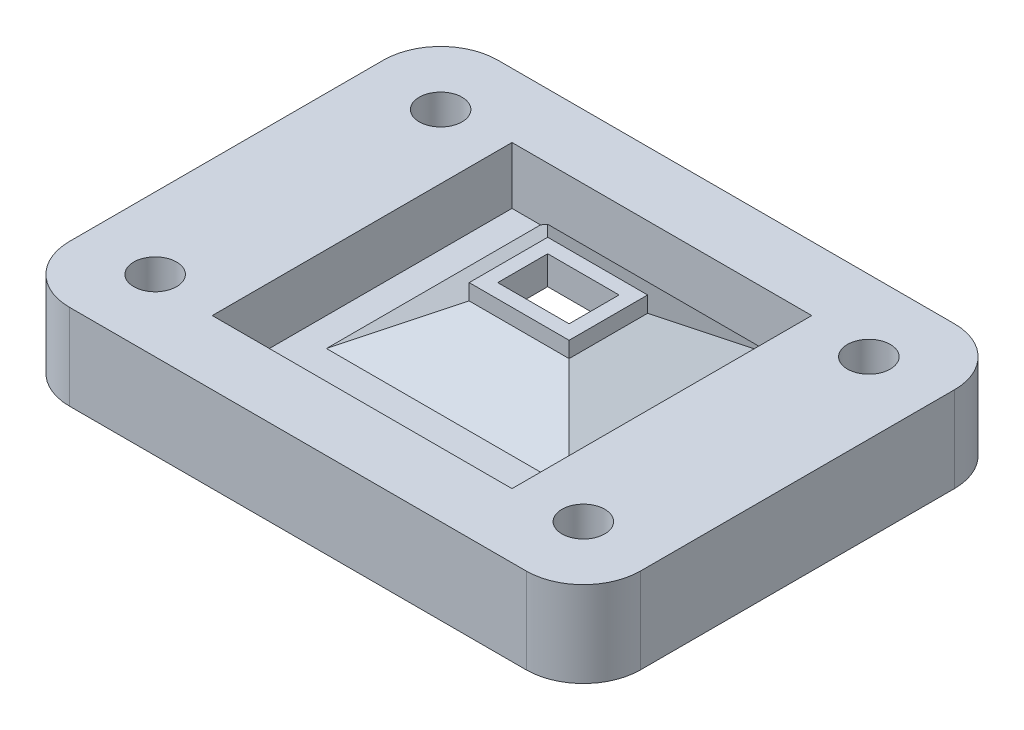
ISO-10303-21;
HEADER;
FILE_DESCRIPTION(('STEP AP214'),'2;1');
FILE_NAME('part.step','',(''),(''),'','','');
FILE_SCHEMA(('AUTOMOTIVE_DESIGN { 1 0 10303 214 1 1 1 1 }'));
ENDSEC;
DATA;
#1=APPLICATION_CONTEXT('core data for automotive mechanical design processes');
#2=APPLICATION_PROTOCOL_DEFINITION('international standard','automotive_design',2000,#1);
#3=PRODUCT_CONTEXT('',#1,'mechanical');
#4=PRODUCT('Part','Part','',(#3));
#5=PRODUCT_RELATED_PRODUCT_CATEGORY('part','',(#4));
#6=PRODUCT_DEFINITION_FORMATION('','',#4);
#7=PRODUCT_DEFINITION_CONTEXT('part definition',#1,'design');
#8=PRODUCT_DEFINITION('design','',#6,#7);
#9=PRODUCT_DEFINITION_SHAPE('','',#8);
#10=(LENGTH_UNIT() NAMED_UNIT(*) SI_UNIT(.MILLI.,.METRE.));
#11=(NAMED_UNIT(*) PLANE_ANGLE_UNIT() SI_UNIT($,.RADIAN.));
#12=(NAMED_UNIT(*) SI_UNIT($,.STERADIAN.) SOLID_ANGLE_UNIT());
#13=UNCERTAINTY_MEASURE_WITH_UNIT(LENGTH_MEASURE(1.E-05),#10,'distance_accuracy_value','');
#14=(GEOMETRIC_REPRESENTATION_CONTEXT(3) GLOBAL_UNCERTAINTY_ASSIGNED_CONTEXT((#13)) GLOBAL_UNIT_ASSIGNED_CONTEXT((#10,
#11,#12)) REPRESENTATION_CONTEXT('',''));
#15=CARTESIAN_POINT('',(0.,0.,0.));
#16=DIRECTION('',(0.,0.,1.));
#17=DIRECTION('',(1.,0.,0.));
#18=AXIS2_PLACEMENT_3D('',#15,#16,#17);
#19=CARTESIAN_POINT('',(0.,2.,0.));
#20=DIRECTION('',(0.,-1.,0.));
#21=DIRECTION('',(0.,0.,-1.));
#22=AXIS2_PLACEMENT_3D('',#19,#20,#21);
#23=PLANE('',#22);
#24=DIRECTION('',(-1.,0.,0.));
#25=VECTOR('',#24,1.);
#26=CARTESIAN_POINT('',(16.5,2.,-10.5));
#27=LINE('',#26,#25);
#28=CARTESIAN_POINT('',(28.5,2.,-10.5));
#29=VERTEX_POINT('',#28);
#30=CARTESIAN_POINT('',(11.5,2.,-10.5));
#31=VERTEX_POINT('',#30);
#32=EDGE_CURVE('E403',#29,#31,#27,.T.);
#33=ORIENTED_EDGE('',*,*,#32,.T.);
#34=DIRECTION('',(0.,0.,-1.));
#35=VECTOR('',#34,1.);
#36=CARTESIAN_POINT('',(11.5,2.,-21.));
#37=LINE('',#36,#35);
#38=CARTESIAN_POINT('',(11.5,2.,-25.5));
#39=VERTEX_POINT('',#38);
#40=EDGE_CURVE('E407',#31,#39,#37,.T.);
#41=ORIENTED_EDGE('',*,*,#40,.T.);
#42=DIRECTION('',(-1.,0.,0.));
#43=VECTOR('',#42,1.);
#44=CARTESIAN_POINT('',(9.5,2.,-25.5));
#45=LINE('',#44,#43);
#46=CARTESIAN_POINT('',(9.5,2.,-25.5));
#47=VERTEX_POINT('',#46);
#48=EDGE_CURVE('E269',#39,#47,#45,.T.);
#49=ORIENTED_EDGE('',*,*,#48,.T.);
#50=DIRECTION('',(0.,0.,1.));
#51=VECTOR('',#50,1.);
#52=CARTESIAN_POINT('',(9.5,2.,-4.5));
#53=LINE('',#52,#51);
#54=CARTESIAN_POINT('',(9.5,2.,-4.5));
#55=VERTEX_POINT('',#54);
#56=EDGE_CURVE('E259',#47,#55,#53,.T.);
#57=ORIENTED_EDGE('',*,*,#56,.T.);
#58=DIRECTION('',(1.,0.,0.));
#59=VECTOR('',#58,1.);
#60=CARTESIAN_POINT('',(9.5,2.,-4.5));
#61=LINE('',#60,#59);
#62=CARTESIAN_POINT('',(30.5,2.,-4.5));
#63=VERTEX_POINT('',#62);
#64=EDGE_CURVE('E262',#55,#63,#61,.T.);
#65=ORIENTED_EDGE('',*,*,#64,.T.);
#66=DIRECTION('',(0.,0.,-1.));
#67=VECTOR('',#66,1.);
#68=CARTESIAN_POINT('',(30.5,2.,-4.5));
#69=LINE('',#68,#67);
#70=CARTESIAN_POINT('',(30.5,2.,-25.5));
#71=VERTEX_POINT('',#70);
#72=EDGE_CURVE('E266',#63,#71,#69,.T.);
#73=ORIENTED_EDGE('',*,*,#72,.T.);
#74=CARTESIAN_POINT('',(28.5,2.,-25.5));
#75=VERTEX_POINT('',#74);
#76=EDGE_CURVE('E270',#71,#75,#45,.T.);
#77=ORIENTED_EDGE('',*,*,#76,.T.);
#78=DIRECTION('',(0.,0.,1.));
#79=VECTOR('',#78,1.);
#80=CARTESIAN_POINT('',(28.5,2.,-15.5));
#81=LINE('',#80,#79);
#82=EDGE_CURVE('E405',#75,#29,#81,.T.);
#83=ORIENTED_EDGE('',*,*,#82,.T.);
#84=EDGE_LOOP('',(#33,#41,#49,#57,#65,#73,#77,#83));
#85=FACE_BOUND('',#84,.T.);
#86=ADVANCED_FACE('F35',(#85),#23,.F.);
#87=CARTESIAN_POINT('',(0.,6.,0.));
#88=DIRECTION('',(1.,0.,0.));
#89=DIRECTION('',(0.,0.,-1.));
#90=AXIS2_PLACEMENT_3D('',#87,#88,#89);
#91=PLANE('',#90);
#92=DIRECTION('',(0.,0.,1.));
#93=VECTOR('',#92,1.);
#94=CARTESIAN_POINT('',(0.,6.,0.));
#95=LINE('',#94,#93);
#96=CARTESIAN_POINT('',(0.,6.,-26.));
#97=VERTEX_POINT('',#96);
#98=CARTESIAN_POINT('',(0.,6.,-4.));
#99=VERTEX_POINT('',#98);
#100=EDGE_CURVE('E316',#97,#99,#95,.T.);
#101=ORIENTED_EDGE('',*,*,#100,.F.);
#102=DIRECTION('',(0.,-1.,0.));
#103=VECTOR('',#102,1.);
#104=CARTESIAN_POINT('',(0.,6.,-26.));
#105=LINE('',#104,#103);
#106=CARTESIAN_POINT('',(0.,0.,-26.));
#107=VERTEX_POINT('',#106);
#108=EDGE_CURVE('E341',#97,#107,#105,.T.);
#109=ORIENTED_EDGE('',*,*,#108,.T.);
#110=DIRECTION('',(0.,0.,1.));
#111=VECTOR('',#110,1.);
#112=CARTESIAN_POINT('',(0.,0.,0.));
#113=LINE('',#112,#111);
#114=CARTESIAN_POINT('',(0.,0.,-4.));
#115=VERTEX_POINT('',#114);
#116=EDGE_CURVE('E315',#107,#115,#113,.T.);
#117=ORIENTED_EDGE('',*,*,#116,.T.);
#118=DIRECTION('',(0.,-1.,0.));
#119=VECTOR('',#118,1.);
#120=CARTESIAN_POINT('',(0.,6.,-4.));
#121=LINE('',#120,#119);
#122=EDGE_CURVE('E329',#115,#99,#121,.F.);
#123=ORIENTED_EDGE('',*,*,#122,.T.);
#124=EDGE_LOOP('',(#101,#109,#117,#123));
#125=FACE_BOUND('',#124,.T.);
#126=ADVANCED_FACE('F487',(#125),#91,.F.);
#127=CARTESIAN_POINT('',(0.,6.,0.));
#128=DIRECTION('',(0.,0.,-1.));
#129=DIRECTION('',(-1.,0.,0.));
#130=AXIS2_PLACEMENT_3D('',#127,#128,#129);
#131=PLANE('',#130);
#132=DIRECTION('',(1.,0.,0.));
#133=VECTOR('',#132,1.);
#134=CARTESIAN_POINT('',(0.,0.,0.));
#135=LINE('',#134,#133);
#136=CARTESIAN_POINT('',(4.,0.,0.));
#137=VERTEX_POINT('',#136);
#138=CARTESIAN_POINT('',(36.,0.,0.));
#139=VERTEX_POINT('',#138);
#140=EDGE_CURVE('E332',#137,#139,#135,.T.);
#141=ORIENTED_EDGE('',*,*,#140,.T.);
#142=DIRECTION('',(0.,-1.,0.));
#143=VECTOR('',#142,1.);
#144=CARTESIAN_POINT('',(36.,6.,0.));
#145=LINE('',#144,#143);
#146=CARTESIAN_POINT('',(36.,6.,0.));
#147=VERTEX_POINT('',#146);
#148=EDGE_CURVE('E373',#139,#147,#145,.F.);
#149=ORIENTED_EDGE('',*,*,#148,.T.);
#150=DIRECTION('',(1.,0.,0.));
#151=VECTOR('',#150,1.);
#152=CARTESIAN_POINT('',(0.,6.,0.));
#153=LINE('',#152,#151);
#154=CARTESIAN_POINT('',(4.,6.,0.));
#155=VERTEX_POINT('',#154);
#156=EDGE_CURVE('E319',#155,#147,#153,.T.);
#157=ORIENTED_EDGE('',*,*,#156,.F.);
#158=DIRECTION('',(0.,-1.,0.));
#159=VECTOR('',#158,1.);
#160=CARTESIAN_POINT('',(4.,6.,0.));
#161=LINE('',#160,#159);
#162=EDGE_CURVE('E370',#155,#137,#161,.T.);
#163=ORIENTED_EDGE('',*,*,#162,.T.);
#164=EDGE_LOOP('',(#141,#149,#157,#163));
#165=FACE_BOUND('',#164,.T.);
#166=ADVANCED_FACE('F494',(#165),#131,.F.);
#167=CARTESIAN_POINT('',(40.,6.,0.));
#168=DIRECTION('',(-1.,0.,0.));
#169=DIRECTION('',(0.,0.,1.));
#170=AXIS2_PLACEMENT_3D('',#167,#168,#169);
#171=PLANE('',#170);
#172=DIRECTION('',(0.,0.,-1.));
#173=VECTOR('',#172,1.);
#174=CARTESIAN_POINT('',(40.,0.,0.));
#175=LINE('',#174,#173);
#176=CARTESIAN_POINT('',(40.,0.,-4.));
#177=VERTEX_POINT('',#176);
#178=CARTESIAN_POINT('',(40.,0.,-26.));
#179=VERTEX_POINT('',#178);
#180=EDGE_CURVE('E335',#177,#179,#175,.T.);
#181=ORIENTED_EDGE('',*,*,#180,.T.);
#182=DIRECTION('',(0.,-1.,0.));
#183=VECTOR('',#182,1.);
#184=CARTESIAN_POINT('',(40.,6.,-26.));
#185=LINE('',#184,#183);
#186=CARTESIAN_POINT('',(40.,6.,-26.));
#187=VERTEX_POINT('',#186);
#188=EDGE_CURVE('E368',#179,#187,#185,.F.);
#189=ORIENTED_EDGE('',*,*,#188,.T.);
#190=DIRECTION('',(0.,0.,-1.));
#191=VECTOR('',#190,1.);
#192=CARTESIAN_POINT('',(40.,6.,0.));
#193=LINE('',#192,#191);
#194=CARTESIAN_POINT('',(40.,6.,-4.));
#195=VERTEX_POINT('',#194);
#196=EDGE_CURVE('E323',#195,#187,#193,.T.);
#197=ORIENTED_EDGE('',*,*,#196,.F.);
#198=DIRECTION('',(0.,-1.,0.));
#199=VECTOR('',#198,1.);
#200=CARTESIAN_POINT('',(40.,6.,-4.));
#201=LINE('',#200,#199);
#202=EDGE_CURVE('E365',#195,#177,#201,.T.);
#203=ORIENTED_EDGE('',*,*,#202,.T.);
#204=EDGE_LOOP('',(#181,#189,#197,#203));
#205=FACE_BOUND('',#204,.T.);
#206=ADVANCED_FACE('F534',(#205),#171,.F.);
#207=CARTESIAN_POINT('',(0.,6.,-30.));
#208=DIRECTION('',(0.,0.,1.));
#209=DIRECTION('',(1.,0.,0.));
#210=AXIS2_PLACEMENT_3D('',#207,#208,#209);
#211=PLANE('',#210);
#212=DIRECTION('',(-1.,0.,0.));
#213=VECTOR('',#212,1.);
#214=CARTESIAN_POINT('',(0.,0.,-30.));
#215=LINE('',#214,#213);
#216=CARTESIAN_POINT('',(36.,0.,-30.));
#217=VERTEX_POINT('',#216);
#218=CARTESIAN_POINT('',(4.,0.,-30.));
#219=VERTEX_POINT('',#218);
#220=EDGE_CURVE('E320',#217,#219,#215,.T.);
#221=ORIENTED_EDGE('',*,*,#220,.T.);
#222=DIRECTION('',(0.,-1.,0.));
#223=VECTOR('',#222,1.);
#224=CARTESIAN_POINT('',(4.,6.,-30.));
#225=LINE('',#224,#223);
#226=CARTESIAN_POINT('',(4.,6.,-30.));
#227=VERTEX_POINT('',#226);
#228=EDGE_CURVE('E355',#219,#227,#225,.F.);
#229=ORIENTED_EDGE('',*,*,#228,.T.);
#230=DIRECTION('',(-1.,0.,0.));
#231=VECTOR('',#230,1.);
#232=CARTESIAN_POINT('',(0.,6.,-30.));
#233=LINE('',#232,#231);
#234=CARTESIAN_POINT('',(36.,6.,-30.));
#235=VERTEX_POINT('',#234);
#236=EDGE_CURVE('E326',#235,#227,#233,.T.);
#237=ORIENTED_EDGE('',*,*,#236,.F.);
#238=DIRECTION('',(0.,-1.,0.));
#239=VECTOR('',#238,1.);
#240=CARTESIAN_POINT('',(36.,6.,-30.));
#241=LINE('',#240,#239);
#242=EDGE_CURVE('E352',#235,#217,#241,.T.);
#243=ORIENTED_EDGE('',*,*,#242,.T.);
#244=EDGE_LOOP('',(#221,#229,#237,#243));
#245=FACE_BOUND('',#244,.T.);
#246=ADVANCED_FACE('F528',(#245),#211,.F.);
#247=CARTESIAN_POINT('',(0.,6.,0.));
#248=DIRECTION('',(0.,-1.,0.));
#249=DIRECTION('',(0.,0.,-1.));
#250=AXIS2_PLACEMENT_3D('',#247,#248,#249);
#251=PLANE('',#250);
#252=DIRECTION('',(1.,0.,0.));
#253=VECTOR('',#252,1.);
#254=CARTESIAN_POINT('',(9.5,6.,-4.5));
#255=LINE('',#254,#253);
#256=CARTESIAN_POINT('',(9.5,6.,-4.5));
#257=VERTEX_POINT('',#256);
#258=CARTESIAN_POINT('',(30.5,6.,-4.5));
#259=VERTEX_POINT('',#258);
#260=EDGE_CURVE('E275',#257,#259,#255,.T.);
#261=ORIENTED_EDGE('',*,*,#260,.F.);
#262=DIRECTION('',(0.,0.,1.));
#263=VECTOR('',#262,1.);
#264=CARTESIAN_POINT('',(9.5,6.,-4.5));
#265=LINE('',#264,#263);
#266=CARTESIAN_POINT('',(9.5,6.,-25.5));
#267=VERTEX_POINT('',#266);
#268=EDGE_CURVE('E216',#267,#257,#265,.T.);
#269=ORIENTED_EDGE('',*,*,#268,.F.);
#270=DIRECTION('',(-1.,0.,0.));
#271=VECTOR('',#270,1.);
#272=CARTESIAN_POINT('',(9.5,6.,-25.5));
#273=LINE('',#272,#271);
#274=CARTESIAN_POINT('',(30.5,6.,-25.5));
#275=VERTEX_POINT('',#274);
#276=EDGE_CURVE('E263',#275,#267,#273,.T.);
#277=ORIENTED_EDGE('',*,*,#276,.F.);
#278=DIRECTION('',(0.,0.,-1.));
#279=VECTOR('',#278,1.);
#280=CARTESIAN_POINT('',(30.5,6.,-4.5));
#281=LINE('',#280,#279);
#282=EDGE_CURVE('E278',#259,#275,#281,.T.);
#283=ORIENTED_EDGE('',*,*,#282,.F.);
#284=EDGE_LOOP('',(#261,#269,#277,#283));
#285=FACE_BOUND('',#284,.T.);
#286=CARTESIAN_POINT('',(5.,6.,-25.));
#287=DIRECTION('',(0.,1.,0.));
#288=DIRECTION('',(0.,0.,-1.));
#289=AXIS2_PLACEMENT_3D('',#286,#287,#288);
#290=CIRCLE('',#289,1.5);
#291=CARTESIAN_POINT('',(5.,6.,-26.5));
#292=VERTEX_POINT('',#291);
#293=EDGE_CURVE('E292',#292,#292,#290,.T.);
#294=ORIENTED_EDGE('',*,*,#293,.F.);
#295=EDGE_LOOP('',(#294));
#296=FACE_BOUND('',#295,.T.);
#297=CARTESIAN_POINT('',(35.,6.,-5.));
#298=DIRECTION('',(0.,1.,0.));
#299=DIRECTION('',(0.,0.,-1.));
#300=AXIS2_PLACEMENT_3D('',#297,#298,#299);
#301=CIRCLE('',#300,1.5);
#302=CARTESIAN_POINT('',(35.,6.,-6.5));
#303=VERTEX_POINT('',#302);
#304=EDGE_CURVE('E300',#303,#303,#301,.T.);
#305=ORIENTED_EDGE('',*,*,#304,.F.);
#306=EDGE_LOOP('',(#305));
#307=FACE_BOUND('',#306,.T.);
#308=CARTESIAN_POINT('',(35.,6.,-25.));
#309=DIRECTION('',(0.,1.,0.));
#310=DIRECTION('',(0.,0.,1.));
#311=AXIS2_PLACEMENT_3D('',#308,#309,#310);
#312=CIRCLE('',#311,1.5);
#313=CARTESIAN_POINT('',(35.,6.,-23.5));
#314=VERTEX_POINT('',#313);
#315=EDGE_CURVE('E285',#314,#314,#312,.T.);
#316=ORIENTED_EDGE('',*,*,#315,.F.);
#317=EDGE_LOOP('',(#316));
#318=FACE_BOUND('',#317,.T.);
#319=CARTESIAN_POINT('',(5.,6.,-5.));
#320=DIRECTION('',(0.,1.,0.));
#321=DIRECTION('',(0.,0.,1.));
#322=AXIS2_PLACEMENT_3D('',#319,#320,#321);
#323=CIRCLE('',#322,1.5);
#324=CARTESIAN_POINT('',(5.,6.,-3.5));
#325=VERTEX_POINT('',#324);
#326=EDGE_CURVE('E299',#325,#325,#323,.T.);
#327=ORIENTED_EDGE('',*,*,#326,.F.);
#328=EDGE_LOOP('',(#327));
#329=FACE_BOUND('',#328,.T.);
#330=ORIENTED_EDGE('',*,*,#236,.T.);
#331=CARTESIAN_POINT('',(4.,6.,-26.));
#332=DIRECTION('',(0.,-1.,0.));
#333=DIRECTION('',(0.,0.,-1.));
#334=AXIS2_PLACEMENT_3D('',#331,#332,#333);
#335=CIRCLE('',#334,4.);
#336=EDGE_CURVE('E363',#227,#97,#335,.F.);
#337=ORIENTED_EDGE('',*,*,#336,.T.);
#338=ORIENTED_EDGE('',*,*,#100,.T.);
#339=CARTESIAN_POINT('',(4.,6.,-4.));
#340=DIRECTION('',(0.,-1.,0.));
#341=DIRECTION('',(0.,0.,-1.));
#342=AXIS2_PLACEMENT_3D('',#339,#340,#341);
#343=CIRCLE('',#342,4.);
#344=EDGE_CURVE('E357',#99,#155,#343,.F.);
#345=ORIENTED_EDGE('',*,*,#344,.T.);
#346=ORIENTED_EDGE('',*,*,#156,.T.);
#347=CARTESIAN_POINT('',(36.,6.,-4.));
#348=DIRECTION('',(0.,-1.,0.));
#349=DIRECTION('',(0.,0.,-1.));
#350=AXIS2_PLACEMENT_3D('',#347,#348,#349);
#351=CIRCLE('',#350,4.);
#352=EDGE_CURVE('E359',#147,#195,#351,.F.);
#353=ORIENTED_EDGE('',*,*,#352,.T.);
#354=ORIENTED_EDGE('',*,*,#196,.T.);
#355=CARTESIAN_POINT('',(36.,6.,-26.));
#356=DIRECTION('',(0.,-1.,0.));
#357=DIRECTION('',(0.,0.,-1.));
#358=AXIS2_PLACEMENT_3D('',#355,#356,#357);
#359=CIRCLE('',#358,4.);
#360=EDGE_CURVE('E361',#187,#235,#359,.F.);
#361=ORIENTED_EDGE('',*,*,#360,.T.);
#362=EDGE_LOOP('',(#330,#337,#338,#345,#346,#353,#354,#361));
#363=FACE_BOUND('',#362,.T.);
#364=ADVANCED_FACE('F454',(#285,#296,#307,#318,#329,#363),#251,.F.);
#365=CARTESIAN_POINT('',(0.,0.,0.));
#366=DIRECTION('',(0.,-1.,0.));
#367=DIRECTION('',(0.,0.,-1.));
#368=AXIS2_PLACEMENT_3D('',#365,#366,#367);
#369=PLANE('',#368);
#370=DIRECTION('',(-1.,0.,0.));
#371=VECTOR('',#370,1.);
#372=CARTESIAN_POINT('',(17.5,0.,-26.9282032302755));
#373=LINE('',#372,#371);
#374=CARTESIAN_POINT('',(29.4282032302755,0.,-26.9282032302755));
#375=VERTEX_POINT('',#374);
#376=CARTESIAN_POINT('',(10.5717967697245,0.,-26.9282032302755));
#377=VERTEX_POINT('',#376);
#378=EDGE_CURVE('E375',#375,#377,#373,.T.);
#379=ORIENTED_EDGE('',*,*,#378,.T.);
#380=DIRECTION('',(0.,0.,1.));
#381=VECTOR('',#380,1.);
#382=CARTESIAN_POINT('',(10.5717967697245,0.,-16.5));
#383=LINE('',#382,#381);
#384=CARTESIAN_POINT('',(10.5717967697245,0.,-9.5717967697245));
#385=VERTEX_POINT('',#384);
#386=EDGE_CURVE('E381',#377,#385,#383,.T.);
#387=ORIENTED_EDGE('',*,*,#386,.T.);
#388=DIRECTION('',(1.,0.,0.));
#389=VECTOR('',#388,1.);
#390=CARTESIAN_POINT('',(22.5,0.,-9.5717967697245));
#391=LINE('',#390,#389);
#392=CARTESIAN_POINT('',(29.4282032302755,0.,-9.5717967697245));
#393=VERTEX_POINT('',#392);
#394=EDGE_CURVE('E379',#385,#393,#391,.T.);
#395=ORIENTED_EDGE('',*,*,#394,.T.);
#396=DIRECTION('',(0.,0.,-1.));
#397=VECTOR('',#396,1.);
#398=CARTESIAN_POINT('',(29.4282032302755,0.,-20.));
#399=LINE('',#398,#397);
#400=EDGE_CURVE('E377',#393,#375,#399,.T.);
#401=ORIENTED_EDGE('',*,*,#400,.T.);
#402=EDGE_LOOP('',(#379,#387,#395,#401));
#403=FACE_BOUND('',#402,.T.);
#404=CARTESIAN_POINT('',(5.,0.,-25.));
#405=DIRECTION('',(0.,-1.,0.));
#406=DIRECTION('',(0.,0.,-1.));
#407=AXIS2_PLACEMENT_3D('',#404,#405,#406);
#408=CIRCLE('',#407,1.5);
#409=CARTESIAN_POINT('',(5.,0.,-26.5));
#410=VERTEX_POINT('',#409);
#411=EDGE_CURVE('E295',#410,#410,#408,.F.);
#412=ORIENTED_EDGE('',*,*,#411,.T.);
#413=EDGE_LOOP('',(#412));
#414=FACE_BOUND('',#413,.T.);
#415=CARTESIAN_POINT('',(35.,0.,-5.));
#416=DIRECTION('',(0.,-1.,0.));
#417=DIRECTION('',(0.,0.,-1.));
#418=AXIS2_PLACEMENT_3D('',#415,#416,#417);
#419=CIRCLE('',#418,1.5);
#420=CARTESIAN_POINT('',(35.,0.,-6.5));
#421=VERTEX_POINT('',#420);
#422=EDGE_CURVE('E296',#421,#421,#419,.F.);
#423=ORIENTED_EDGE('',*,*,#422,.T.);
#424=EDGE_LOOP('',(#423));
#425=FACE_BOUND('',#424,.T.);
#426=CARTESIAN_POINT('',(35.,0.,-25.));
#427=DIRECTION('',(0.,-1.,0.));
#428=DIRECTION('',(0.,0.,-1.));
#429=AXIS2_PLACEMENT_3D('',#426,#427,#428);
#430=CIRCLE('',#429,1.5);
#431=CARTESIAN_POINT('',(35.,0.,-26.5));
#432=VERTEX_POINT('',#431);
#433=EDGE_CURVE('E303',#432,#432,#430,.F.);
#434=ORIENTED_EDGE('',*,*,#433,.T.);
#435=EDGE_LOOP('',(#434));
#436=FACE_BOUND('',#435,.T.);
#437=CARTESIAN_POINT('',(5.,0.,-5.));
#438=DIRECTION('',(0.,-1.,0.));
#439=DIRECTION('',(0.,0.,-1.));
#440=AXIS2_PLACEMENT_3D('',#437,#438,#439);
#441=CIRCLE('',#440,1.5);
#442=CARTESIAN_POINT('',(5.,0.,-6.5));
#443=VERTEX_POINT('',#442);
#444=EDGE_CURVE('E312',#443,#443,#441,.F.);
#445=ORIENTED_EDGE('',*,*,#444,.T.);
#446=EDGE_LOOP('',(#445));
#447=FACE_BOUND('',#446,.T.);
#448=ORIENTED_EDGE('',*,*,#116,.F.);
#449=CARTESIAN_POINT('',(4.,0.,-26.));
#450=DIRECTION('',(0.,-1.,0.));
#451=DIRECTION('',(0.,0.,-1.));
#452=AXIS2_PLACEMENT_3D('',#449,#450,#451);
#453=CIRCLE('',#452,4.);
#454=EDGE_CURVE('E350',#107,#219,#453,.T.);
#455=ORIENTED_EDGE('',*,*,#454,.T.);
#456=ORIENTED_EDGE('',*,*,#220,.F.);
#457=CARTESIAN_POINT('',(36.,0.,-26.));
#458=DIRECTION('',(0.,-1.,0.));
#459=DIRECTION('',(0.,0.,-1.));
#460=AXIS2_PLACEMENT_3D('',#457,#458,#459);
#461=CIRCLE('',#460,4.);
#462=EDGE_CURVE('E348',#217,#179,#461,.T.);
#463=ORIENTED_EDGE('',*,*,#462,.T.);
#464=ORIENTED_EDGE('',*,*,#180,.F.);
#465=CARTESIAN_POINT('',(36.,0.,-4.));
#466=DIRECTION('',(0.,-1.,0.));
#467=DIRECTION('',(0.,0.,-1.));
#468=AXIS2_PLACEMENT_3D('',#465,#466,#467);
#469=CIRCLE('',#468,4.);
#470=EDGE_CURVE('E346',#177,#139,#469,.T.);
#471=ORIENTED_EDGE('',*,*,#470,.T.);
#472=ORIENTED_EDGE('',*,*,#140,.F.);
#473=CARTESIAN_POINT('',(4.,0.,-4.));
#474=DIRECTION('',(0.,-1.,0.));
#475=DIRECTION('',(0.,0.,-1.));
#476=AXIS2_PLACEMENT_3D('',#473,#474,#475);
#477=CIRCLE('',#476,4.);
#478=EDGE_CURVE('E344',#137,#115,#477,.T.);
#479=ORIENTED_EDGE('',*,*,#478,.T.);
#480=EDGE_LOOP('',(#448,#455,#456,#463,#464,#471,#472,#479));
#481=FACE_BOUND('',#480,.T.);
#482=ADVANCED_FACE('F524',(#403,#414,#425,#436,#447,#481),#369,.T.);
#483=CARTESIAN_POINT('',(5.,-4.24264068711928,-5.));
#484=DIRECTION('',(0.,1.,0.));
#485=DIRECTION('',(0.,0.,1.));
#486=AXIS2_PLACEMENT_3D('',#483,#484,#485);
#487=CYLINDRICAL_SURFACE('',#486,1.5);
#488=ORIENTED_EDGE('',*,*,#326,.T.);
#489=EDGE_LOOP('',(#488));
#490=FACE_BOUND('',#489,.T.);
#491=ORIENTED_EDGE('',*,*,#444,.F.);
#492=EDGE_LOOP('',(#491));
#493=FACE_BOUND('',#492,.T.);
#494=ADVANCED_FACE('F520',(#490,#493),#487,.F.);
#495=CARTESIAN_POINT('',(35.,-4.24264068711928,-25.));
#496=DIRECTION('',(0.,1.,0.));
#497=DIRECTION('',(0.,0.,1.));
#498=AXIS2_PLACEMENT_3D('',#495,#496,#497);
#499=CYLINDRICAL_SURFACE('',#498,1.5);
#500=ORIENTED_EDGE('',*,*,#315,.T.);
#501=EDGE_LOOP('',(#500));
#502=FACE_BOUND('',#501,.T.);
#503=ORIENTED_EDGE('',*,*,#433,.F.);
#504=EDGE_LOOP('',(#503));
#505=FACE_BOUND('',#504,.T.);
#506=ADVANCED_FACE('F516',(#502,#505),#499,.F.);
#507=CARTESIAN_POINT('',(35.,-4.24264068711928,-5.));
#508=DIRECTION('',(0.,1.,0.));
#509=DIRECTION('',(0.,0.,1.));
#510=AXIS2_PLACEMENT_3D('',#507,#508,#509);
#511=CYLINDRICAL_SURFACE('',#510,1.5);
#512=ORIENTED_EDGE('',*,*,#304,.T.);
#513=EDGE_LOOP('',(#512));
#514=FACE_BOUND('',#513,.T.);
#515=ORIENTED_EDGE('',*,*,#422,.F.);
#516=EDGE_LOOP('',(#515));
#517=FACE_BOUND('',#516,.T.);
#518=ADVANCED_FACE('F512',(#514,#517),#511,.F.);
#519=CARTESIAN_POINT('',(5.,-4.24264068711928,-25.));
#520=DIRECTION('',(0.,1.,0.));
#521=DIRECTION('',(0.,0.,1.));
#522=AXIS2_PLACEMENT_3D('',#519,#520,#521);
#523=CYLINDRICAL_SURFACE('',#522,1.5);
#524=ORIENTED_EDGE('',*,*,#293,.T.);
#525=EDGE_LOOP('',(#524));
#526=FACE_BOUND('',#525,.T.);
#527=ORIENTED_EDGE('',*,*,#411,.F.);
#528=EDGE_LOOP('',(#527));
#529=FACE_BOUND('',#528,.T.);
#530=ADVANCED_FACE('F508',(#526,#529),#523,.F.);
#531=CARTESIAN_POINT('',(4.,6.,-26.));
#532=DIRECTION('',(0.,-1.,0.));
#533=DIRECTION('',(0.,0.,-1.));
#534=AXIS2_PLACEMENT_3D('',#531,#532,#533);
#535=CYLINDRICAL_SURFACE('',#534,4.);
#536=ORIENTED_EDGE('',*,*,#336,.F.);
#537=ORIENTED_EDGE('',*,*,#228,.F.);
#538=ORIENTED_EDGE('',*,*,#454,.F.);
#539=ORIENTED_EDGE('',*,*,#108,.F.);
#540=EDGE_LOOP('',(#536,#537,#538,#539));
#541=FACE_BOUND('',#540,.T.);
#542=ADVANCED_FACE('F511',(#541),#535,.T.);
#543=CARTESIAN_POINT('',(36.,6.,-26.));
#544=DIRECTION('',(0.,-1.,0.));
#545=DIRECTION('',(0.,0.,-1.));
#546=AXIS2_PLACEMENT_3D('',#543,#544,#545);
#547=CYLINDRICAL_SURFACE('',#546,4.);
#548=ORIENTED_EDGE('',*,*,#360,.F.);
#549=ORIENTED_EDGE('',*,*,#188,.F.);
#550=ORIENTED_EDGE('',*,*,#462,.F.);
#551=ORIENTED_EDGE('',*,*,#242,.F.);
#552=EDGE_LOOP('',(#548,#549,#550,#551));
#553=FACE_BOUND('',#552,.T.);
#554=ADVANCED_FACE('F544',(#553),#547,.T.);
#555=CARTESIAN_POINT('',(36.,6.,-4.));
#556=DIRECTION('',(0.,-1.,0.));
#557=DIRECTION('',(0.,0.,-1.));
#558=AXIS2_PLACEMENT_3D('',#555,#556,#557);
#559=CYLINDRICAL_SURFACE('',#558,4.);
#560=ORIENTED_EDGE('',*,*,#352,.F.);
#561=ORIENTED_EDGE('',*,*,#148,.F.);
#562=ORIENTED_EDGE('',*,*,#470,.F.);
#563=ORIENTED_EDGE('',*,*,#202,.F.);
#564=EDGE_LOOP('',(#560,#561,#562,#563));
#565=FACE_BOUND('',#564,.T.);
#566=ADVANCED_FACE('F548',(#565),#559,.T.);
#567=CARTESIAN_POINT('',(4.,6.,-4.));
#568=DIRECTION('',(0.,-1.,0.));
#569=DIRECTION('',(0.,0.,-1.));
#570=AXIS2_PLACEMENT_3D('',#567,#568,#569);
#571=CYLINDRICAL_SURFACE('',#570,4.);
#572=ORIENTED_EDGE('',*,*,#344,.F.);
#573=ORIENTED_EDGE('',*,*,#122,.F.);
#574=ORIENTED_EDGE('',*,*,#478,.F.);
#575=ORIENTED_EDGE('',*,*,#162,.F.);
#576=EDGE_LOOP('',(#572,#573,#574,#575));
#577=FACE_BOUND('',#576,.T.);
#578=ADVANCED_FACE('F507',(#577),#571,.T.);
#579=CARTESIAN_POINT('',(9.5,2.,-4.5));
#580=DIRECTION('',(-1.,0.,0.));
#581=DIRECTION('',(0.,0.,1.));
#582=AXIS2_PLACEMENT_3D('',#579,#580,#581);
#583=PLANE('',#582);
#584=ORIENTED_EDGE('',*,*,#268,.T.);
#585=DIRECTION('',(0.,1.,0.));
#586=VECTOR('',#585,1.);
#587=CARTESIAN_POINT('',(9.5,2.,-4.5));
#588=LINE('',#587,#586);
#589=EDGE_CURVE('E273',#55,#257,#588,.T.);
#590=ORIENTED_EDGE('',*,*,#589,.F.);
#591=ORIENTED_EDGE('',*,*,#56,.F.);
#592=DIRECTION('',(0.,1.,0.));
#593=VECTOR('',#592,1.);
#594=CARTESIAN_POINT('',(9.5,2.,-25.5));
#595=LINE('',#594,#593);
#596=EDGE_CURVE('E283',#47,#267,#595,.T.);
#597=ORIENTED_EDGE('',*,*,#596,.T.);
#598=EDGE_LOOP('',(#584,#590,#591,#597));
#599=FACE_BOUND('',#598,.T.);
#600=ADVANCED_FACE('F457',(#599),#583,.F.);
#601=CARTESIAN_POINT('',(9.5,2.,-25.5));
#602=DIRECTION('',(0.,0.,-1.));
#603=DIRECTION('',(-1.,0.,0.));
#604=AXIS2_PLACEMENT_3D('',#601,#602,#603);
#605=PLANE('',#604);
#606=ORIENTED_EDGE('',*,*,#48,.F.);
#607=DIRECTION('',(-0.866025403784436,-0.500000000000004,0.));
#608=VECTOR('',#607,1.);
#609=CARTESIAN_POINT('',(16.5,4.88675134594814,-25.5));
#610=LINE('',#609,#608);
#611=CARTESIAN_POINT('',(12.,2.2886751345948,-25.5));
#612=VERTEX_POINT('',#611);
#613=EDGE_CURVE('E414',#39,#612,#610,.F.);
#614=ORIENTED_EDGE('',*,*,#613,.T.);
#615=DIRECTION('',(-1.,0.,0.));
#616=VECTOR('',#615,1.);
#617=CARTESIAN_POINT('',(23.5,2.2886751345948,-25.5));
#618=LINE('',#617,#616);
#619=CARTESIAN_POINT('',(28.,2.2886751345948,-25.5));
#620=VERTEX_POINT('',#619);
#621=EDGE_CURVE('E412',#612,#620,#618,.F.);
#622=ORIENTED_EDGE('',*,*,#621,.T.);
#623=DIRECTION('',(-0.866025403784436,0.500000000000004,0.));
#624=VECTOR('',#623,1.);
#625=CARTESIAN_POINT('',(23.5,4.88675134594814,-25.5));
#626=LINE('',#625,#624);
#627=EDGE_CURVE('E410',#620,#75,#626,.F.);
#628=ORIENTED_EDGE('',*,*,#627,.T.);
#629=ORIENTED_EDGE('',*,*,#76,.F.);
#630=DIRECTION('',(0.,1.,0.));
#631=VECTOR('',#630,1.);
#632=CARTESIAN_POINT('',(30.5,2.,-25.5));
#633=LINE('',#632,#631);
#634=EDGE_CURVE('E286',#71,#275,#633,.T.);
#635=ORIENTED_EDGE('',*,*,#634,.T.);
#636=ORIENTED_EDGE('',*,*,#276,.T.);
#637=ORIENTED_EDGE('',*,*,#596,.F.);
#638=EDGE_LOOP('',(#606,#614,#622,#628,#629,#635,#636,#637));
#639=FACE_BOUND('',#638,.T.);
#640=ADVANCED_FACE('F441',(#639),#605,.F.);
#641=CARTESIAN_POINT('',(30.5,2.,-4.5));
#642=DIRECTION('',(1.,0.,0.));
#643=DIRECTION('',(0.,0.,-1.));
#644=AXIS2_PLACEMENT_3D('',#641,#642,#643);
#645=PLANE('',#644);
#646=ORIENTED_EDGE('',*,*,#282,.T.);
#647=ORIENTED_EDGE('',*,*,#634,.F.);
#648=ORIENTED_EDGE('',*,*,#72,.F.);
#649=DIRECTION('',(0.,1.,0.));
#650=VECTOR('',#649,1.);
#651=CARTESIAN_POINT('',(30.5,2.,-4.5));
#652=LINE('',#651,#650);
#653=EDGE_CURVE('E288',#63,#259,#652,.T.);
#654=ORIENTED_EDGE('',*,*,#653,.T.);
#655=EDGE_LOOP('',(#646,#647,#648,#654));
#656=FACE_BOUND('',#655,.T.);
#657=ADVANCED_FACE('F446',(#656),#645,.F.);
#658=CARTESIAN_POINT('',(9.5,2.,-4.5));
#659=DIRECTION('',(0.,0.,1.));
#660=DIRECTION('',(1.,0.,0.));
#661=AXIS2_PLACEMENT_3D('',#658,#659,#660);
#662=PLANE('',#661);
#663=ORIENTED_EDGE('',*,*,#260,.T.);
#664=ORIENTED_EDGE('',*,*,#653,.F.);
#665=ORIENTED_EDGE('',*,*,#64,.F.);
#666=ORIENTED_EDGE('',*,*,#589,.T.);
#667=EDGE_LOOP('',(#663,#664,#665,#666));
#668=FACE_BOUND('',#667,.T.);
#669=ADVANCED_FACE('F459',(#668),#662,.F.);
#670=CARTESIAN_POINT('',(17.5,-6.10327780786685,-16.5));
#671=DIRECTION('',(0.,0.,1.));
#672=DIRECTION('',(1.,0.,0.));
#673=AXIS2_PLACEMENT_3D('',#670,#671,#672);
#674=PLANE('',#673);
#675=DIRECTION('',(0.,1.,0.));
#676=VECTOR('',#675,1.);
#677=CARTESIAN_POINT('',(22.5,-6.10327780786685,-16.5));
#678=LINE('',#677,#676);
#679=CARTESIAN_POINT('',(22.5,4.00000000000001,-16.5));
#680=VERTEX_POINT('',#679);
#681=CARTESIAN_POINT('',(22.5,6.,-16.5));
#682=VERTEX_POINT('',#681);
#683=EDGE_CURVE('E254',#680,#682,#678,.T.);
#684=ORIENTED_EDGE('',*,*,#683,.F.);
#685=DIRECTION('',(-1.,0.,0.));
#686=VECTOR('',#685,1.);
#687=CARTESIAN_POINT('',(17.5,4.00000000000001,-16.5));
#688=LINE('',#687,#686);
#689=CARTESIAN_POINT('',(17.5,4.00000000000001,-16.5));
#690=VERTEX_POINT('',#689);
#691=EDGE_CURVE('E212',#680,#690,#688,.T.);
#692=ORIENTED_EDGE('',*,*,#691,.T.);
#693=DIRECTION('',(0.,1.,0.));
#694=VECTOR('',#693,1.);
#695=CARTESIAN_POINT('',(17.5,-6.10327780786685,-16.5));
#696=LINE('',#695,#694);
#697=CARTESIAN_POINT('',(17.5,6.,-16.5));
#698=VERTEX_POINT('',#697);
#699=EDGE_CURVE('E204',#690,#698,#696,.T.);
#700=ORIENTED_EDGE('',*,*,#699,.T.);
#701=DIRECTION('',(1.,0.,0.));
#702=VECTOR('',#701,1.);
#703=CARTESIAN_POINT('',(17.5,6.,-16.5));
#704=LINE('',#703,#702);
#705=EDGE_CURVE('E209',#698,#682,#704,.T.);
#706=ORIENTED_EDGE('',*,*,#705,.T.);
#707=EDGE_LOOP('',(#684,#692,#700,#706));
#708=FACE_BOUND('',#707,.T.);
#709=ADVANCED_FACE('F207',(#708),#674,.F.);
#710=CARTESIAN_POINT('',(22.5,-6.10327780786685,-16.5));
#711=DIRECTION('',(1.,0.,0.));
#712=DIRECTION('',(0.,0.,-1.));
#713=AXIS2_PLACEMENT_3D('',#710,#711,#712);
#714=PLANE('',#713);
#715=DIRECTION('',(0.,1.,0.));
#716=VECTOR('',#715,1.);
#717=CARTESIAN_POINT('',(22.5,-6.10327780786685,-20.));
#718=LINE('',#717,#716);
#719=CARTESIAN_POINT('',(22.5,4.00000000000001,-20.));
#720=VERTEX_POINT('',#719);
#721=CARTESIAN_POINT('',(22.5,6.,-20.));
#722=VERTEX_POINT('',#721);
#723=EDGE_CURVE('E256',#720,#722,#718,.T.);
#724=ORIENTED_EDGE('',*,*,#723,.F.);
#725=DIRECTION('',(0.,0.,1.));
#726=VECTOR('',#725,1.);
#727=CARTESIAN_POINT('',(22.5,4.00000000000001,-16.5));
#728=LINE('',#727,#726);
#729=EDGE_CURVE('E387',#720,#680,#728,.T.);
#730=ORIENTED_EDGE('',*,*,#729,.T.);
#731=ORIENTED_EDGE('',*,*,#683,.T.);
#732=DIRECTION('',(0.,0.,-1.));
#733=VECTOR('',#732,1.);
#734=CARTESIAN_POINT('',(22.5,6.,-20.));
#735=LINE('',#734,#733);
#736=EDGE_CURVE('E230',#682,#722,#735,.T.);
#737=ORIENTED_EDGE('',*,*,#736,.T.);
#738=EDGE_LOOP('',(#724,#730,#731,#737));
#739=FACE_BOUND('',#738,.T.);
#740=ADVANCED_FACE('F653',(#739),#714,.F.);
#741=CARTESIAN_POINT('',(17.5,-6.10327780786685,-20.));
#742=DIRECTION('',(0.,0.,-1.));
#743=DIRECTION('',(-1.,0.,0.));
#744=AXIS2_PLACEMENT_3D('',#741,#742,#743);
#745=PLANE('',#744);
#746=DIRECTION('',(0.,1.,0.));
#747=VECTOR('',#746,1.);
#748=CARTESIAN_POINT('',(17.5,-6.10327780786685,-20.));
#749=LINE('',#748,#747);
#750=CARTESIAN_POINT('',(17.5,4.00000000000001,-20.));
#751=VERTEX_POINT('',#750);
#752=CARTESIAN_POINT('',(17.5,6.,-20.));
#753=VERTEX_POINT('',#752);
#754=EDGE_CURVE('E217',#751,#753,#749,.T.);
#755=ORIENTED_EDGE('',*,*,#754,.F.);
#756=DIRECTION('',(1.,0.,0.));
#757=VECTOR('',#756,1.);
#758=CARTESIAN_POINT('',(22.5,4.00000000000001,-20.));
#759=LINE('',#758,#757);
#760=EDGE_CURVE('E389',#751,#720,#759,.T.);
#761=ORIENTED_EDGE('',*,*,#760,.T.);
#762=ORIENTED_EDGE('',*,*,#723,.T.);
#763=DIRECTION('',(-1.,0.,0.));
#764=VECTOR('',#763,1.);
#765=CARTESIAN_POINT('',(17.5,6.,-20.));
#766=LINE('',#765,#764);
#767=EDGE_CURVE('E232',#722,#753,#766,.T.);
#768=ORIENTED_EDGE('',*,*,#767,.T.);
#769=EDGE_LOOP('',(#755,#761,#762,#768));
#770=FACE_BOUND('',#769,.T.);
#771=ADVANCED_FACE('F658',(#770),#745,.F.);
#772=CARTESIAN_POINT('',(17.5,-6.10327780786685,-16.5));
#773=DIRECTION('',(-1.,0.,0.));
#774=DIRECTION('',(0.,0.,1.));
#775=AXIS2_PLACEMENT_3D('',#772,#773,#774);
#776=PLANE('',#775);
#777=ORIENTED_EDGE('',*,*,#699,.F.);
#778=DIRECTION('',(0.,0.,-1.));
#779=VECTOR('',#778,1.);
#780=CARTESIAN_POINT('',(17.5,4.00000000000001,-20.));
#781=LINE('',#780,#779);
#782=EDGE_CURVE('E384',#690,#751,#781,.T.);
#783=ORIENTED_EDGE('',*,*,#782,.T.);
#784=ORIENTED_EDGE('',*,*,#754,.T.);
#785=DIRECTION('',(0.,0.,1.));
#786=VECTOR('',#785,1.);
#787=CARTESIAN_POINT('',(17.5,6.,-20.));
#788=LINE('',#787,#786);
#789=EDGE_CURVE('E220',#753,#698,#788,.T.);
#790=ORIENTED_EDGE('',*,*,#789,.T.);
#791=EDGE_LOOP('',(#777,#783,#784,#790));
#792=FACE_BOUND('',#791,.T.);
#793=ADVANCED_FACE('F221',(#792),#776,.F.);
#794=CARTESIAN_POINT('',(0.,6.,0.));
#795=DIRECTION('',(0.,1.,0.));
#796=DIRECTION('',(0.,0.,1.));
#797=AXIS2_PLACEMENT_3D('',#794,#795,#796);
#798=PLANE('',#797);
#799=DIRECTION('',(0.,0.,1.));
#800=VECTOR('',#799,1.);
#801=CARTESIAN_POINT('',(16.5,6.,-21.));
#802=LINE('',#801,#800);
#803=CARTESIAN_POINT('',(16.5,6.,-21.));
#804=VERTEX_POINT('',#803);
#805=CARTESIAN_POINT('',(16.5,6.,-15.5));
#806=VERTEX_POINT('',#805);
#807=EDGE_CURVE('E236',#804,#806,#802,.T.);
#808=ORIENTED_EDGE('',*,*,#807,.T.);
#809=DIRECTION('',(1.,0.,0.));
#810=VECTOR('',#809,1.);
#811=CARTESIAN_POINT('',(16.5,6.,-15.5));
#812=LINE('',#811,#810);
#813=CARTESIAN_POINT('',(23.5,6.,-15.5));
#814=VERTEX_POINT('',#813);
#815=EDGE_CURVE('E239',#806,#814,#812,.T.);
#816=ORIENTED_EDGE('',*,*,#815,.T.);
#817=DIRECTION('',(0.,0.,-1.));
#818=VECTOR('',#817,1.);
#819=CARTESIAN_POINT('',(23.5,6.,-15.5));
#820=LINE('',#819,#818);
#821=CARTESIAN_POINT('',(23.5,6.,-21.));
#822=VERTEX_POINT('',#821);
#823=EDGE_CURVE('E241',#814,#822,#820,.T.);
#824=ORIENTED_EDGE('',*,*,#823,.T.);
#825=DIRECTION('',(-1.,0.,0.));
#826=VECTOR('',#825,1.);
#827=CARTESIAN_POINT('',(23.5,6.,-21.));
#828=LINE('',#827,#826);
#829=EDGE_CURVE('E243',#822,#804,#828,.T.);
#830=ORIENTED_EDGE('',*,*,#829,.T.);
#831=EDGE_LOOP('',(#808,#816,#824,#830));
#832=FACE_BOUND('',#831,.T.);
#833=ORIENTED_EDGE('',*,*,#705,.F.);
#834=ORIENTED_EDGE('',*,*,#789,.F.);
#835=ORIENTED_EDGE('',*,*,#767,.F.);
#836=ORIENTED_EDGE('',*,*,#736,.F.);
#837=EDGE_LOOP('',(#833,#834,#835,#836));
#838=FACE_BOUND('',#837,.T.);
#839=ADVANCED_FACE('F228',(#832,#838),#798,.T.);
#840=CARTESIAN_POINT('',(16.5,6.,-21.));
#841=DIRECTION('',(1.,0.,0.));
#842=DIRECTION('',(0.,0.,-1.));
#843=AXIS2_PLACEMENT_3D('',#840,#841,#842);
#844=PLANE('',#843);
#845=DIRECTION('',(0.,-1.,0.));
#846=VECTOR('',#845,1.);
#847=CARTESIAN_POINT('',(16.5,6.,-21.));
#848=LINE('',#847,#846);
#849=CARTESIAN_POINT('',(16.5,4.88675134594814,-21.));
#850=VERTEX_POINT('',#849);
#851=EDGE_CURVE('E245',#804,#850,#848,.T.);
#852=ORIENTED_EDGE('',*,*,#851,.T.);
#853=DIRECTION('',(0.,0.,1.));
#854=VECTOR('',#853,1.);
#855=CARTESIAN_POINT('',(16.5,4.88675134594814,-15.5));
#856=LINE('',#855,#854);
#857=CARTESIAN_POINT('',(16.5,4.88675134594814,-15.5));
#858=VERTEX_POINT('',#857);
#859=EDGE_CURVE('E391',#850,#858,#856,.T.);
#860=ORIENTED_EDGE('',*,*,#859,.T.);
#861=DIRECTION('',(0.,-1.,0.));
#862=VECTOR('',#861,1.);
#863=CARTESIAN_POINT('',(16.5,6.,-15.5));
#864=LINE('',#863,#862);
#865=EDGE_CURVE('E252',#806,#858,#864,.T.);
#866=ORIENTED_EDGE('',*,*,#865,.F.);
#867=ORIENTED_EDGE('',*,*,#807,.F.);
#868=EDGE_LOOP('',(#852,#860,#866,#867));
#869=FACE_BOUND('',#868,.T.);
#870=ADVANCED_FACE('F467',(#869),#844,.F.);
#871=CARTESIAN_POINT('',(16.5,6.,-15.5));
#872=DIRECTION('',(0.,0.,-1.));
#873=DIRECTION('',(-1.,0.,0.));
#874=AXIS2_PLACEMENT_3D('',#871,#872,#873);
#875=PLANE('',#874);
#876=ORIENTED_EDGE('',*,*,#865,.T.);
#877=DIRECTION('',(1.,0.,0.));
#878=VECTOR('',#877,1.);
#879=CARTESIAN_POINT('',(23.5,4.88675134594814,-15.5));
#880=LINE('',#879,#878);
#881=CARTESIAN_POINT('',(23.5,4.88675134594814,-15.5));
#882=VERTEX_POINT('',#881);
#883=EDGE_CURVE('E11',#858,#882,#880,.T.);
#884=ORIENTED_EDGE('',*,*,#883,.T.);
#885=DIRECTION('',(0.,-1.,0.));
#886=VECTOR('',#885,1.);
#887=CARTESIAN_POINT('',(23.5,6.,-15.5));
#888=LINE('',#887,#886);
#889=EDGE_CURVE('E250',#814,#882,#888,.T.);
#890=ORIENTED_EDGE('',*,*,#889,.F.);
#891=ORIENTED_EDGE('',*,*,#815,.F.);
#892=EDGE_LOOP('',(#876,#884,#890,#891));
#893=FACE_BOUND('',#892,.T.);
#894=ADVANCED_FACE('F470',(#893),#875,.F.);
#895=CARTESIAN_POINT('',(23.5,6.,-15.5));
#896=DIRECTION('',(-1.,0.,0.));
#897=DIRECTION('',(0.,0.,1.));
#898=AXIS2_PLACEMENT_3D('',#895,#896,#897);
#899=PLANE('',#898);
#900=ORIENTED_EDGE('',*,*,#889,.T.);
#901=DIRECTION('',(0.,0.,-1.));
#902=VECTOR('',#901,1.);
#903=CARTESIAN_POINT('',(23.5,4.88675134594814,-21.));
#904=LINE('',#903,#902);
#905=CARTESIAN_POINT('',(23.5,4.88675134594814,-21.));
#906=VERTEX_POINT('',#905);
#907=EDGE_CURVE('E44',#882,#906,#904,.T.);
#908=ORIENTED_EDGE('',*,*,#907,.T.);
#909=DIRECTION('',(0.,-1.,0.));
#910=VECTOR('',#909,1.);
#911=CARTESIAN_POINT('',(23.5,6.,-21.));
#912=LINE('',#911,#910);
#913=EDGE_CURVE('E248',#822,#906,#912,.T.);
#914=ORIENTED_EDGE('',*,*,#913,.F.);
#915=ORIENTED_EDGE('',*,*,#823,.F.);
#916=EDGE_LOOP('',(#900,#908,#914,#915));
#917=FACE_BOUND('',#916,.T.);
#918=ADVANCED_FACE('F476',(#917),#899,.F.);
#919=CARTESIAN_POINT('',(23.5,6.,-21.));
#920=DIRECTION('',(0.,0.,1.));
#921=DIRECTION('',(1.,0.,0.));
#922=AXIS2_PLACEMENT_3D('',#919,#920,#921);
#923=PLANE('',#922);
#924=ORIENTED_EDGE('',*,*,#913,.T.);
#925=DIRECTION('',(-1.,0.,0.));
#926=VECTOR('',#925,1.);
#927=CARTESIAN_POINT('',(16.5,4.88675134594814,-21.));
#928=LINE('',#927,#926);
#929=EDGE_CURVE('E416',#906,#850,#928,.T.);
#930=ORIENTED_EDGE('',*,*,#929,.T.);
#931=ORIENTED_EDGE('',*,*,#851,.F.);
#932=ORIENTED_EDGE('',*,*,#829,.F.);
#933=EDGE_LOOP('',(#924,#930,#931,#932));
#934=FACE_BOUND('',#933,.T.);
#935=ADVANCED_FACE('F475',(#934),#923,.F.);
#936=CARTESIAN_POINT('',(29.4282032302755,0.,0.));
#937=DIRECTION('',(-0.500000000000001,-0.866025403784438,0.));
#938=DIRECTION('',(0.,0.,1.));
#939=AXIS2_PLACEMENT_3D('',#936,#937,#938);
#940=PLANE('',#939);
#941=DIRECTION('',(-0.654653670707977,0.377964473009228,-0.654653670707977));
#942=VECTOR('',#941,1.);
#943=CARTESIAN_POINT('',(16.816116131586,7.28159188147141,-22.183883868414));
#944=LINE('',#943,#942);
#945=EDGE_CURVE('E396',#680,#393,#944,.F.);
#946=ORIENTED_EDGE('',*,*,#945,.F.);
#947=ORIENTED_EDGE('',*,*,#729,.F.);
#948=DIRECTION('',(-0.654653670707977,0.377964473009228,0.654653670707977));
#949=VECTOR('',#948,1.);
#950=CARTESIAN_POINT('',(17.8875447030146,6.66300230733966,-15.3875447030146));
#951=LINE('',#950,#949);
#952=EDGE_CURVE('E226',#375,#720,#951,.T.);
#953=ORIENTED_EDGE('',*,*,#952,.F.);
#954=ORIENTED_EDGE('',*,*,#400,.F.);
#955=EDGE_LOOP('',(#946,#947,#953,#954));
#956=FACE_BOUND('',#955,.T.);
#957=ADVANCED_FACE('F483',(#956),#940,.T.);
#958=CARTESIAN_POINT('',(0.,0.,-26.9282032302755));
#959=DIRECTION('',(0.,-0.866025403784438,0.500000000000001));
#960=DIRECTION('',(1.,0.,0.));
#961=AXIS2_PLACEMENT_3D('',#958,#959,#960);
#962=PLANE('',#961);
#963=ORIENTED_EDGE('',*,*,#952,.T.);
#964=ORIENTED_EDGE('',*,*,#760,.F.);
#965=DIRECTION('',(-0.654653670707977,-0.377964473009228,-0.654653670707977));
#966=VECTOR('',#965,1.);
#967=CARTESIAN_POINT('',(22.1124552969854,6.66300230733966,-15.3875447030146));
#968=LINE('',#967,#966);
#969=EDGE_CURVE('E394',#377,#751,#968,.F.);
#970=ORIENTED_EDGE('',*,*,#969,.F.);
#971=ORIENTED_EDGE('',*,*,#378,.F.);
#972=EDGE_LOOP('',(#963,#964,#970,#971));
#973=FACE_BOUND('',#972,.T.);
#974=ADVANCED_FACE('F563',(#973),#962,.T.);
#975=CARTESIAN_POINT('',(0.,0.,-9.5717967697245));
#976=DIRECTION('',(0.,-0.866025403784438,-0.500000000000001));
#977=DIRECTION('',(-1.,0.,0.));
#978=AXIS2_PLACEMENT_3D('',#975,#976,#977);
#979=PLANE('',#978);
#980=ORIENTED_EDGE('',*,*,#945,.T.);
#981=ORIENTED_EDGE('',*,*,#394,.F.);
#982=DIRECTION('',(0.654653670707977,0.377964473009228,-0.654653670707977));
#983=VECTOR('',#982,1.);
#984=CARTESIAN_POINT('',(6.46959815412829,-2.36840547498379,-5.46959815412829));
#985=LINE('',#984,#983);
#986=EDGE_CURVE('E392',#690,#385,#985,.F.);
#987=ORIENTED_EDGE('',*,*,#986,.F.);
#988=ORIENTED_EDGE('',*,*,#691,.F.);
#989=EDGE_LOOP('',(#980,#981,#987,#988));
#990=FACE_BOUND('',#989,.T.);
#991=ADVANCED_FACE('F559',(#990),#979,.T.);
#992=CARTESIAN_POINT('',(10.5717967697245,0.,0.));
#993=DIRECTION('',(0.500000000000001,-0.866025403784438,0.));
#994=DIRECTION('',(0.,0.,-1.));
#995=AXIS2_PLACEMENT_3D('',#992,#993,#994);
#996=PLANE('',#995);
#997=ORIENTED_EDGE('',*,*,#969,.T.);
#998=ORIENTED_EDGE('',*,*,#782,.F.);
#999=ORIENTED_EDGE('',*,*,#986,.T.);
#1000=ORIENTED_EDGE('',*,*,#386,.F.);
#1001=EDGE_LOOP('',(#997,#998,#999,#1000));
#1002=FACE_BOUND('',#1001,.T.);
#1003=ADVANCED_FACE('F556',(#1002),#996,.T.);
#1004=CARTESIAN_POINT('',(23.5,4.88675134594814,-15.5));
#1005=DIRECTION('',(0.500000000000004,0.866025403784436,0.));
#1006=DIRECTION('',(0.,0.,1.));
#1007=AXIS2_PLACEMENT_3D('',#1004,#1005,#1006);
#1008=PLANE('',#1007);
#1009=ORIENTED_EDGE('',*,*,#82,.F.);
#1010=ORIENTED_EDGE('',*,*,#627,.F.);
#1011=DIRECTION('',(0.654653670707976,-0.377964473009231,-0.654653670707976));
#1012=VECTOR('',#1011,1.);
#1013=CARTESIAN_POINT('',(23.5,4.88675134594814,-21.));
#1014=LINE('',#1013,#1012);
#1015=EDGE_CURVE('E39',#906,#620,#1014,.T.);
#1016=ORIENTED_EDGE('',*,*,#1015,.F.);
#1017=ORIENTED_EDGE('',*,*,#907,.F.);
#1018=DIRECTION('',(-0.654653670707976,0.377964473009231,-0.654653670707976));
#1019=VECTOR('',#1018,1.);
#1020=CARTESIAN_POINT('',(20.5,6.61880215351703,-18.5));
#1021=LINE('',#1020,#1019);
#1022=EDGE_CURVE('E423',#29,#882,#1021,.T.);
#1023=ORIENTED_EDGE('',*,*,#1022,.F.);
#1024=EDGE_LOOP('',(#1009,#1010,#1016,#1017,#1023));
#1025=FACE_BOUND('',#1024,.T.);
#1026=ADVANCED_FACE('F37',(#1025),#1008,.T.);
#1027=CARTESIAN_POINT('',(23.5,4.88675134594814,-21.));
#1028=DIRECTION('',(0.,0.866025403784436,-0.500000000000004));
#1029=DIRECTION('',(1.,0.,0.));
#1030=AXIS2_PLACEMENT_3D('',#1027,#1028,#1029);
#1031=PLANE('',#1030);
#1032=ORIENTED_EDGE('',*,*,#1015,.T.);
#1033=ORIENTED_EDGE('',*,*,#621,.F.);
#1034=DIRECTION('',(-0.654653670707976,-0.377964473009231,-0.654653670707976));
#1035=VECTOR('',#1034,1.);
#1036=CARTESIAN_POINT('',(16.5,4.88675134594814,-21.));
#1037=LINE('',#1036,#1035);
#1038=EDGE_CURVE('E421',#850,#612,#1037,.T.);
#1039=ORIENTED_EDGE('',*,*,#1038,.F.);
#1040=ORIENTED_EDGE('',*,*,#929,.F.);
#1041=EDGE_LOOP('',(#1032,#1033,#1039,#1040));
#1042=FACE_BOUND('',#1041,.T.);
#1043=ADVANCED_FACE('F433',(#1042),#1031,.T.);
#1044=CARTESIAN_POINT('',(16.5,4.88675134594814,-15.5));
#1045=DIRECTION('',(0.,0.866025403784436,0.500000000000004));
#1046=DIRECTION('',(-1.,0.,0.));
#1047=AXIS2_PLACEMENT_3D('',#1044,#1045,#1046);
#1048=PLANE('',#1047);
#1049=ORIENTED_EDGE('',*,*,#1022,.T.);
#1050=ORIENTED_EDGE('',*,*,#883,.F.);
#1051=DIRECTION('',(-0.654653670707976,-0.377964473009231,0.654653670707976));
#1052=VECTOR('',#1051,1.);
#1053=CARTESIAN_POINT('',(16.5,4.88675134594814,-15.5));
#1054=LINE('',#1053,#1052);
#1055=EDGE_CURVE('E419',#31,#858,#1054,.F.);
#1056=ORIENTED_EDGE('',*,*,#1055,.F.);
#1057=ORIENTED_EDGE('',*,*,#32,.F.);
#1058=EDGE_LOOP('',(#1049,#1050,#1056,#1057));
#1059=FACE_BOUND('',#1058,.T.);
#1060=ADVANCED_FACE('F573',(#1059),#1048,.T.);
#1061=CARTESIAN_POINT('',(16.5,4.88675134594814,-21.));
#1062=DIRECTION('',(-0.500000000000004,0.866025403784436,0.));
#1063=DIRECTION('',(0.,0.,-1.));
#1064=AXIS2_PLACEMENT_3D('',#1061,#1062,#1063);
#1065=PLANE('',#1064);
#1066=ORIENTED_EDGE('',*,*,#613,.F.);
#1067=ORIENTED_EDGE('',*,*,#40,.F.);
#1068=ORIENTED_EDGE('',*,*,#1055,.T.);
#1069=ORIENTED_EDGE('',*,*,#859,.F.);
#1070=ORIENTED_EDGE('',*,*,#1038,.T.);
#1071=EDGE_LOOP('',(#1066,#1067,#1068,#1069,#1070));
#1072=FACE_BOUND('',#1071,.T.);
#1073=ADVANCED_FACE('F462',(#1072),#1065,.T.);
#1074=CLOSED_SHELL('',(#86,#126,#166,#206,#246,#364,#482,#494,#506,#518,#530,#542,#554,#566,
#578,#600,#640,#657,#669,#709,#740,#771,#793,#839,#870,#894,#918,#935,#957,#974,#991,#1003,
#1026,#1043,#1060,#1073));
#1075=MANIFOLD_SOLID_BREP('B2',#1074);
#1076=ADVANCED_BREP_SHAPE_REPRESENTATION('',(#18,#1075),#14);
#1077=SHAPE_DEFINITION_REPRESENTATION(#9,#1076);
ENDSEC;
END-ISO-10303-21;
